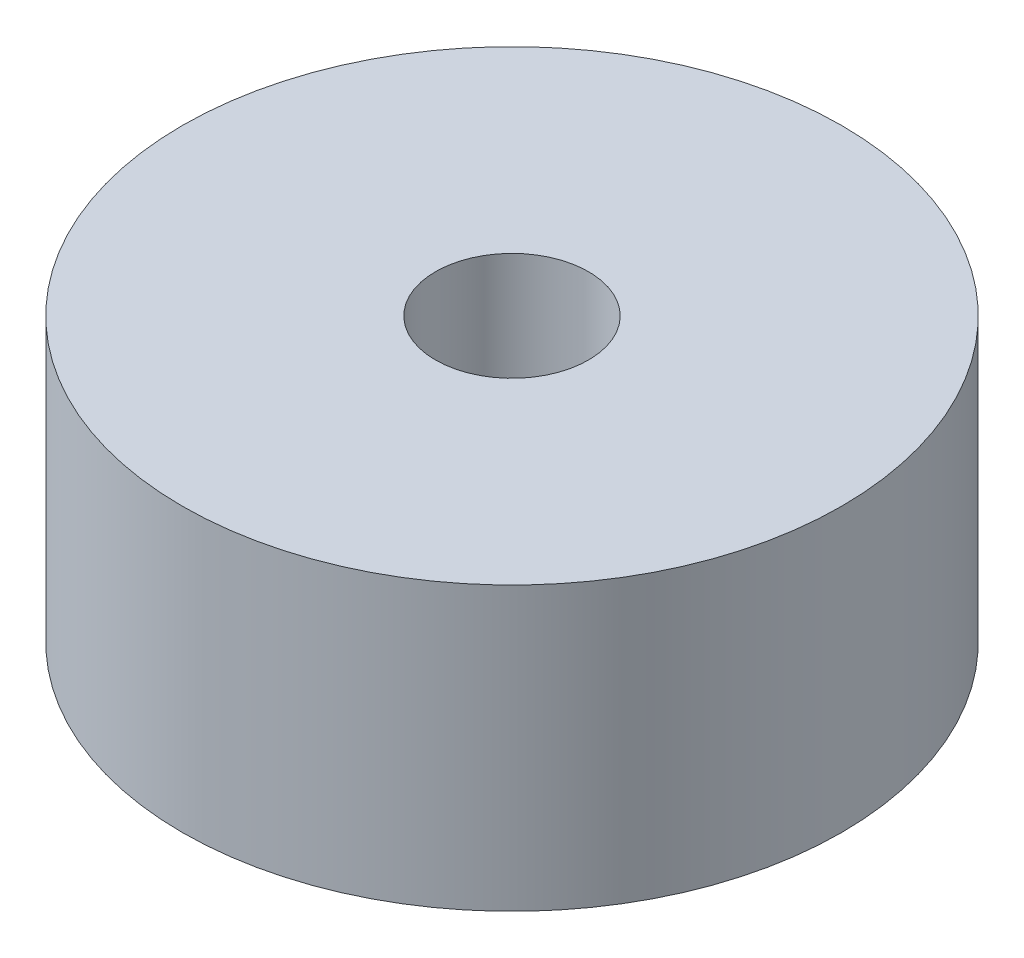
ISO-10303-21;
HEADER;
FILE_DESCRIPTION(('STEP AP214'),'2;1');
FILE_NAME('part.step','',(''),(''),'','','');
FILE_SCHEMA(('AUTOMOTIVE_DESIGN { 1 0 10303 214 1 1 1 1 }'));
ENDSEC;
DATA;
#1=APPLICATION_CONTEXT('core data for automotive mechanical design processes');
#2=APPLICATION_PROTOCOL_DEFINITION('international standard','automotive_design',2000,#1);
#3=PRODUCT_CONTEXT('',#1,'mechanical');
#4=PRODUCT('Part','Part','',(#3));
#5=PRODUCT_RELATED_PRODUCT_CATEGORY('part','',(#4));
#6=PRODUCT_DEFINITION_FORMATION('','',#4);
#7=PRODUCT_DEFINITION_CONTEXT('part definition',#1,'design');
#8=PRODUCT_DEFINITION('design','',#6,#7);
#9=PRODUCT_DEFINITION_SHAPE('','',#8);
#10=(LENGTH_UNIT() NAMED_UNIT(*) SI_UNIT(.MILLI.,.METRE.));
#11=(NAMED_UNIT(*) PLANE_ANGLE_UNIT() SI_UNIT($,.RADIAN.));
#12=(NAMED_UNIT(*) SI_UNIT($,.STERADIAN.) SOLID_ANGLE_UNIT());
#13=UNCERTAINTY_MEASURE_WITH_UNIT(LENGTH_MEASURE(1.E-05),#10,'distance_accuracy_value','');
#14=(GEOMETRIC_REPRESENTATION_CONTEXT(3) GLOBAL_UNCERTAINTY_ASSIGNED_CONTEXT((#13)) GLOBAL_UNIT_ASSIGNED_CONTEXT((#10,
#11,#12)) REPRESENTATION_CONTEXT('',''));
#15=CARTESIAN_POINT('',(0.,0.,0.));
#16=DIRECTION('',(0.,0.,1.));
#17=DIRECTION('',(1.,0.,0.));
#18=AXIS2_PLACEMENT_3D('',#15,#16,#17);
#19=CARTESIAN_POINT('',(0.,4.8,0.));
#20=DIRECTION('',(0.,1.,0.));
#21=DIRECTION('',(0.,0.,1.));
#22=AXIS2_PLACEMENT_3D('',#19,#20,#21);
#23=PLANE('',#22);
#24=CARTESIAN_POINT('',(0.,4.8,0.));
#25=DIRECTION('',(0.,1.,0.));
#26=DIRECTION('',(0.,0.,1.));
#27=AXIS2_PLACEMENT_3D('',#24,#25,#26);
#28=CIRCLE('',#27,5.6);
#29=CARTESIAN_POINT('',(0.,4.8,5.6));
#30=VERTEX_POINT('',#29);
#31=EDGE_CURVE('E11',#30,#30,#28,.T.);
#32=ORIENTED_EDGE('',*,*,#31,.T.);
#33=EDGE_LOOP('',(#32));
#34=FACE_BOUND('',#33,.T.);
#35=CARTESIAN_POINT('',(0.,4.8,0.));
#36=DIRECTION('',(0.,1.,0.));
#37=DIRECTION('',(0.,0.,1.));
#38=AXIS2_PLACEMENT_3D('',#35,#36,#37);
#39=CIRCLE('',#38,1.3);
#40=CARTESIAN_POINT('',(0.,4.8,1.3));
#41=VERTEX_POINT('',#40);
#42=EDGE_CURVE('E51',#41,#41,#39,.T.);
#43=ORIENTED_EDGE('',*,*,#42,.F.);
#44=EDGE_LOOP('',(#43));
#45=FACE_BOUND('',#44,.T.);
#46=ADVANCED_FACE('F40',(#34,#45),#23,.T.);
#47=CARTESIAN_POINT('',(0.,0.,0.));
#48=DIRECTION('',(0.,1.,0.));
#49=DIRECTION('',(0.,0.,1.));
#50=AXIS2_PLACEMENT_3D('',#47,#48,#49);
#51=PLANE('',#50);
#52=CARTESIAN_POINT('',(0.,0.,0.));
#53=DIRECTION('',(0.,1.,0.));
#54=DIRECTION('',(0.,0.,1.));
#55=AXIS2_PLACEMENT_3D('',#52,#53,#54);
#56=CIRCLE('',#55,5.6);
#57=CARTESIAN_POINT('',(0.,0.,5.6));
#58=VERTEX_POINT('',#57);
#59=EDGE_CURVE('E44',#58,#58,#56,.T.);
#60=ORIENTED_EDGE('',*,*,#59,.F.);
#61=EDGE_LOOP('',(#60));
#62=FACE_BOUND('',#61,.T.);
#63=CARTESIAN_POINT('',(0.,0.,0.));
#64=DIRECTION('',(0.,1.,0.));
#65=DIRECTION('',(0.,0.,1.));
#66=AXIS2_PLACEMENT_3D('',#63,#64,#65);
#67=CIRCLE('',#66,1.3);
#68=CARTESIAN_POINT('',(0.,0.,1.3));
#69=VERTEX_POINT('',#68);
#70=EDGE_CURVE('E53',#69,#69,#67,.T.);
#71=ORIENTED_EDGE('',*,*,#70,.T.);
#72=EDGE_LOOP('',(#71));
#73=FACE_BOUND('',#72,.T.);
#74=ADVANCED_FACE('F63',(#62,#73),#51,.F.);
#75=CARTESIAN_POINT('',(0.,4.8,0.));
#76=DIRECTION('',(0.,-1.,0.));
#77=DIRECTION('',(0.,0.,-1.));
#78=AXIS2_PLACEMENT_3D('',#75,#76,#77);
#79=CYLINDRICAL_SURFACE('',#78,5.6);
#80=ORIENTED_EDGE('',*,*,#31,.F.);
#81=EDGE_LOOP('',(#80));
#82=FACE_BOUND('',#81,.T.);
#83=ORIENTED_EDGE('',*,*,#59,.T.);
#84=EDGE_LOOP('',(#83));
#85=FACE_BOUND('',#84,.T.);
#86=ADVANCED_FACE('F42',(#82,#85),#79,.T.);
#87=CARTESIAN_POINT('',(0.,4.8,0.));
#88=DIRECTION('',(0.,-1.,0.));
#89=DIRECTION('',(0.,0.,-1.));
#90=AXIS2_PLACEMENT_3D('',#87,#88,#89);
#91=CYLINDRICAL_SURFACE('',#90,1.3);
#92=ORIENTED_EDGE('',*,*,#42,.T.);
#93=EDGE_LOOP('',(#92));
#94=FACE_BOUND('',#93,.T.);
#95=ORIENTED_EDGE('',*,*,#70,.F.);
#96=EDGE_LOOP('',(#95));
#97=FACE_BOUND('',#96,.T.);
#98=ADVANCED_FACE('F59',(#94,#97),#91,.F.);
#99=CLOSED_SHELL('',(#46,#74,#86,#98));
#100=MANIFOLD_SOLID_BREP('B2',#99);
#101=ADVANCED_BREP_SHAPE_REPRESENTATION('',(#18,#100),#14);
#102=SHAPE_DEFINITION_REPRESENTATION(#9,#101);
ENDSEC;
END-ISO-10303-21;
